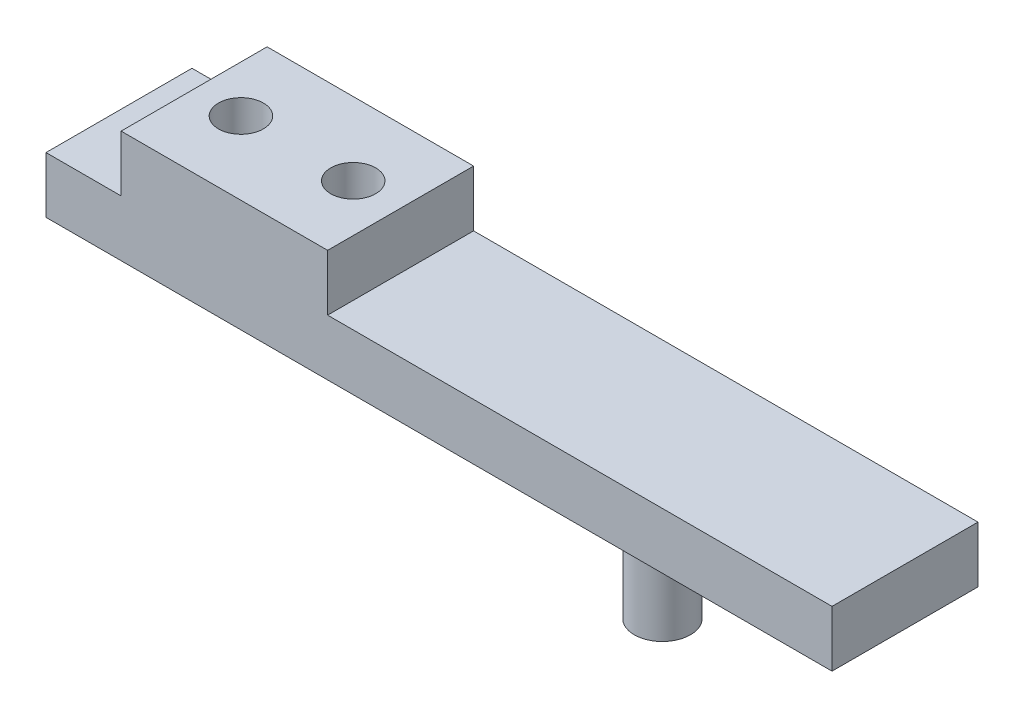
ISO-10303-21;
HEADER;
FILE_DESCRIPTION(('STEP AP214'),'2;1');
FILE_NAME('part.step','',(''),(''),'','','');
FILE_SCHEMA(('AUTOMOTIVE_DESIGN { 1 0 10303 214 1 1 1 1 }'));
ENDSEC;
DATA;
#1=APPLICATION_CONTEXT('core data for automotive mechanical design processes');
#2=APPLICATION_PROTOCOL_DEFINITION('international standard','automotive_design',2000,#1);
#3=PRODUCT_CONTEXT('',#1,'mechanical');
#4=PRODUCT('Part','Part','',(#3));
#5=PRODUCT_RELATED_PRODUCT_CATEGORY('part','',(#4));
#6=PRODUCT_DEFINITION_FORMATION('','',#4);
#7=PRODUCT_DEFINITION_CONTEXT('part definition',#1,'design');
#8=PRODUCT_DEFINITION('design','',#6,#7);
#9=PRODUCT_DEFINITION_SHAPE('','',#8);
#10=(LENGTH_UNIT() NAMED_UNIT(*) SI_UNIT(.MILLI.,.METRE.));
#11=(NAMED_UNIT(*) PLANE_ANGLE_UNIT() SI_UNIT($,.RADIAN.));
#12=(NAMED_UNIT(*) SI_UNIT($,.STERADIAN.) SOLID_ANGLE_UNIT());
#13=UNCERTAINTY_MEASURE_WITH_UNIT(LENGTH_MEASURE(1.E-05),#10,'distance_accuracy_value','');
#14=(GEOMETRIC_REPRESENTATION_CONTEXT(3) GLOBAL_UNCERTAINTY_ASSIGNED_CONTEXT((#13)) GLOBAL_UNIT_ASSIGNED_CONTEXT((#10,
#11,#12)) REPRESENTATION_CONTEXT('',''));
#15=CARTESIAN_POINT('',(0.,0.,0.));
#16=DIRECTION('',(0.,0.,1.));
#17=DIRECTION('',(1.,0.,0.));
#18=AXIS2_PLACEMENT_3D('',#15,#16,#17);
#19=CARTESIAN_POINT('',(0.,5.,0.));
#20=DIRECTION('',(0.,1.,0.));
#21=DIRECTION('',(0.,0.,1.));
#22=AXIS2_PLACEMENT_3D('',#19,#20,#21);
#23=PLANE('',#22);
#24=DIRECTION('',(0.,0.,1.));
#25=VECTOR('',#24,1.);
#26=CARTESIAN_POINT('',(-28.3095534894096,5.,-6.5));
#27=LINE('',#26,#25);
#28=CARTESIAN_POINT('',(-28.3095534894096,5.,-6.5));
#29=VERTEX_POINT('',#28);
#30=CARTESIAN_POINT('',(-28.3095534894096,5.,6.5));
#31=VERTEX_POINT('',#30);
#32=EDGE_CURVE('E125',#29,#31,#27,.T.);
#33=ORIENTED_EDGE('',*,*,#32,.F.);
#34=DIRECTION('',(-1.,0.,0.));
#35=VECTOR('',#34,1.);
#36=CARTESIAN_POINT('',(-35.,5.,-6.5));
#37=LINE('',#36,#35);
#38=CARTESIAN_POINT('',(-35.,5.,-6.5));
#39=VERTEX_POINT('',#38);
#40=EDGE_CURVE('E141',#29,#39,#37,.T.);
#41=ORIENTED_EDGE('',*,*,#40,.T.);
#42=DIRECTION('',(0.,0.,1.));
#43=VECTOR('',#42,1.);
#44=CARTESIAN_POINT('',(-35.,5.,-6.5));
#45=LINE('',#44,#43);
#46=CARTESIAN_POINT('',(-35.,5.,6.5));
#47=VERTEX_POINT('',#46);
#48=EDGE_CURVE('E145',#39,#47,#45,.T.);
#49=ORIENTED_EDGE('',*,*,#48,.T.);
#50=DIRECTION('',(1.,0.,0.));
#51=VECTOR('',#50,1.);
#52=CARTESIAN_POINT('',(-35.,5.,6.5));
#53=LINE('',#52,#51);
#54=EDGE_CURVE('E61',#47,#31,#53,.T.);
#55=ORIENTED_EDGE('',*,*,#54,.T.);
#56=EDGE_LOOP('',(#33,#41,#49,#55));
#57=FACE_BOUND('',#56,.T.);
#58=ADVANCED_FACE('F38',(#57),#23,.T.);
#59=CARTESIAN_POINT('',(35.,5.,-6.5));
#60=DIRECTION('',(-1.,0.,0.));
#61=DIRECTION('',(0.,0.,1.));
#62=AXIS2_PLACEMENT_3D('',#59,#60,#61);
#63=PLANE('',#62);
#64=DIRECTION('',(0.,0.,-1.));
#65=VECTOR('',#64,1.);
#66=CARTESIAN_POINT('',(35.,0.,-6.5));
#67=LINE('',#66,#65);
#68=CARTESIAN_POINT('',(35.,0.,6.5));
#69=VERTEX_POINT('',#68);
#70=CARTESIAN_POINT('',(35.,0.,-6.5));
#71=VERTEX_POINT('',#70);
#72=EDGE_CURVE('E136',#69,#71,#67,.T.);
#73=ORIENTED_EDGE('',*,*,#72,.T.);
#74=DIRECTION('',(0.,-1.,0.));
#75=VECTOR('',#74,1.);
#76=CARTESIAN_POINT('',(35.,5.,-6.5));
#77=LINE('',#76,#75);
#78=CARTESIAN_POINT('',(35.,5.,-6.5));
#79=VERTEX_POINT('',#78);
#80=EDGE_CURVE('E46',#79,#71,#77,.T.);
#81=ORIENTED_EDGE('',*,*,#80,.F.);
#82=DIRECTION('',(0.,0.,-1.));
#83=VECTOR('',#82,1.);
#84=CARTESIAN_POINT('',(35.,5.,-6.5));
#85=LINE('',#84,#83);
#86=CARTESIAN_POINT('',(35.,5.,6.5));
#87=VERTEX_POINT('',#86);
#88=EDGE_CURVE('E138',#87,#79,#85,.T.);
#89=ORIENTED_EDGE('',*,*,#88,.F.);
#90=DIRECTION('',(0.,-1.,0.));
#91=VECTOR('',#90,1.);
#92=CARTESIAN_POINT('',(35.,5.,6.5));
#93=LINE('',#92,#91);
#94=EDGE_CURVE('E149',#87,#69,#93,.T.);
#95=ORIENTED_EDGE('',*,*,#94,.T.);
#96=EDGE_LOOP('',(#73,#81,#89,#95));
#97=FACE_BOUND('',#96,.T.);
#98=ADVANCED_FACE('F40',(#97),#63,.F.);
#99=CARTESIAN_POINT('',(-35.,5.,-6.5));
#100=DIRECTION('',(0.,0.,1.));
#101=DIRECTION('',(1.,0.,0.));
#102=AXIS2_PLACEMENT_3D('',#99,#100,#101);
#103=PLANE('',#102);
#104=DIRECTION('',(-1.,0.,0.));
#105=VECTOR('',#104,1.);
#106=CARTESIAN_POINT('',(-35.,0.,-6.5));
#107=LINE('',#106,#105);
#108=CARTESIAN_POINT('',(-35.,0.,-6.5));
#109=VERTEX_POINT('',#108);
#110=EDGE_CURVE('E152',#71,#109,#107,.T.);
#111=ORIENTED_EDGE('',*,*,#110,.T.);
#112=DIRECTION('',(0.,-1.,0.));
#113=VECTOR('',#112,1.);
#114=CARTESIAN_POINT('',(-35.,5.,-6.5));
#115=LINE('',#114,#113);
#116=EDGE_CURVE('E162',#39,#109,#115,.T.);
#117=ORIENTED_EDGE('',*,*,#116,.F.);
#118=ORIENTED_EDGE('',*,*,#40,.F.);
#119=DIRECTION('',(0.,-1.,0.));
#120=VECTOR('',#119,1.);
#121=CARTESIAN_POINT('',(-28.3095534894096,10.,-6.5));
#122=LINE('',#121,#120);
#123=CARTESIAN_POINT('',(-28.3095534894096,10.,-6.5));
#124=VERTEX_POINT('',#123);
#125=EDGE_CURVE('E187',#124,#29,#122,.T.);
#126=ORIENTED_EDGE('',*,*,#125,.F.);
#127=DIRECTION('',(-1.,0.,0.));
#128=VECTOR('',#127,1.);
#129=CARTESIAN_POINT('',(-28.3095534894096,10.,-6.5));
#130=LINE('',#129,#128);
#131=CARTESIAN_POINT('',(-9.91920416380848,10.,-6.5));
#132=VERTEX_POINT('',#131);
#133=EDGE_CURVE('E119',#132,#124,#130,.T.);
#134=ORIENTED_EDGE('',*,*,#133,.F.);
#135=DIRECTION('',(0.,-1.,0.));
#136=VECTOR('',#135,1.);
#137=CARTESIAN_POINT('',(-9.91920416380848,10.,-6.5));
#138=LINE('',#137,#136);
#139=CARTESIAN_POINT('',(-9.91920416380848,5.,-6.5));
#140=VERTEX_POINT('',#139);
#141=EDGE_CURVE('E131',#132,#140,#138,.T.);
#142=ORIENTED_EDGE('',*,*,#141,.T.);
#143=EDGE_CURVE('E143',#79,#140,#37,.T.);
#144=ORIENTED_EDGE('',*,*,#143,.F.);
#145=ORIENTED_EDGE('',*,*,#80,.T.);
#146=EDGE_LOOP('',(#111,#117,#118,#126,#134,#142,#144,#145));
#147=FACE_BOUND('',#146,.T.);
#148=ADVANCED_FACE('F167',(#147),#103,.F.);
#149=CARTESIAN_POINT('',(-35.,5.,-6.5));
#150=DIRECTION('',(1.,0.,0.));
#151=DIRECTION('',(0.,0.,-1.));
#152=AXIS2_PLACEMENT_3D('',#149,#150,#151);
#153=PLANE('',#152);
#154=DIRECTION('',(0.,0.,1.));
#155=VECTOR('',#154,1.);
#156=CARTESIAN_POINT('',(-35.,0.,-6.5));
#157=LINE('',#156,#155);
#158=CARTESIAN_POINT('',(-35.,0.,6.5));
#159=VERTEX_POINT('',#158);
#160=EDGE_CURVE('E154',#109,#159,#157,.T.);
#161=ORIENTED_EDGE('',*,*,#160,.T.);
#162=DIRECTION('',(0.,-1.,0.));
#163=VECTOR('',#162,1.);
#164=CARTESIAN_POINT('',(-35.,5.,6.5));
#165=LINE('',#164,#163);
#166=EDGE_CURVE('E159',#47,#159,#165,.T.);
#167=ORIENTED_EDGE('',*,*,#166,.F.);
#168=ORIENTED_EDGE('',*,*,#48,.F.);
#169=ORIENTED_EDGE('',*,*,#116,.T.);
#170=EDGE_LOOP('',(#161,#167,#168,#169));
#171=FACE_BOUND('',#170,.T.);
#172=ADVANCED_FACE('F180',(#171),#153,.F.);
#173=CARTESIAN_POINT('',(-35.,5.,6.5));
#174=DIRECTION('',(0.,0.,-1.));
#175=DIRECTION('',(-1.,0.,0.));
#176=AXIS2_PLACEMENT_3D('',#173,#174,#175);
#177=PLANE('',#176);
#178=DIRECTION('',(1.,0.,0.));
#179=VECTOR('',#178,1.);
#180=CARTESIAN_POINT('',(-35.,0.,6.5));
#181=LINE('',#180,#179);
#182=EDGE_CURVE('E142',#159,#69,#181,.T.);
#183=ORIENTED_EDGE('',*,*,#182,.T.);
#184=ORIENTED_EDGE('',*,*,#94,.F.);
#185=CARTESIAN_POINT('',(-9.91920416380848,5.,6.5));
#186=VERTEX_POINT('',#185);
#187=EDGE_CURVE('E147',#186,#87,#53,.T.);
#188=ORIENTED_EDGE('',*,*,#187,.F.);
#189=DIRECTION('',(0.,-1.,0.));
#190=VECTOR('',#189,1.);
#191=CARTESIAN_POINT('',(-9.91920416380848,10.,6.5));
#192=LINE('',#191,#190);
#193=CARTESIAN_POINT('',(-9.91920416380848,10.,6.5));
#194=VERTEX_POINT('',#193);
#195=EDGE_CURVE('E109',#194,#186,#192,.T.);
#196=ORIENTED_EDGE('',*,*,#195,.F.);
#197=DIRECTION('',(1.,0.,0.));
#198=VECTOR('',#197,1.);
#199=CARTESIAN_POINT('',(-28.3095534894096,10.,6.5));
#200=LINE('',#199,#198);
#201=CARTESIAN_POINT('',(-28.3095534894096,10.,6.5));
#202=VERTEX_POINT('',#201);
#203=EDGE_CURVE('E102',#202,#194,#200,.T.);
#204=ORIENTED_EDGE('',*,*,#203,.F.);
#205=DIRECTION('',(0.,-1.,0.));
#206=VECTOR('',#205,1.);
#207=CARTESIAN_POINT('',(-28.3095534894096,10.,6.5));
#208=LINE('',#207,#206);
#209=EDGE_CURVE('E106',#202,#31,#208,.T.);
#210=ORIENTED_EDGE('',*,*,#209,.T.);
#211=ORIENTED_EDGE('',*,*,#54,.F.);
#212=ORIENTED_EDGE('',*,*,#166,.T.);
#213=EDGE_LOOP('',(#183,#184,#188,#196,#204,#210,#211,#212));
#214=FACE_BOUND('',#213,.T.);
#215=ADVANCED_FACE('F104',(#214),#177,.F.);
#216=DIRECTION('',(0.,0.,-1.));
#217=VECTOR('',#216,1.);
#218=CARTESIAN_POINT('',(-9.91920416380848,5.,-6.5));
#219=LINE('',#218,#217);
#220=EDGE_CURVE('E53',#186,#140,#219,.T.);
#221=ORIENTED_EDGE('',*,*,#220,.F.);
#222=ORIENTED_EDGE('',*,*,#187,.T.);
#223=ORIENTED_EDGE('',*,*,#88,.T.);
#224=ORIENTED_EDGE('',*,*,#143,.T.);
#225=EDGE_LOOP('',(#221,#222,#223,#224));
#226=FACE_BOUND('',#225,.T.);
#227=ADVANCED_FACE('F182',(#226),#23,.T.);
#228=CARTESIAN_POINT('',(0.,0.,0.));
#229=DIRECTION('',(0.,1.,0.));
#230=DIRECTION('',(0.,0.,1.));
#231=AXIS2_PLACEMENT_3D('',#228,#229,#230);
#232=PLANE('',#231);
#233=CARTESIAN_POINT('',(13.3945457686465,0.,0.));
#234=DIRECTION('',(0.,1.,0.));
#235=DIRECTION('',(0.,0.,1.));
#236=AXIS2_PLACEMENT_3D('',#233,#234,#235);
#237=CIRCLE('',#236,2.5);
#238=CARTESIAN_POINT('',(13.3945457686465,0.,2.5));
#239=VERTEX_POINT('',#238);
#240=EDGE_CURVE('E11',#239,#239,#237,.F.);
#241=ORIENTED_EDGE('',*,*,#240,.F.);
#242=EDGE_LOOP('',(#241));
#243=FACE_BOUND('',#242,.T.);
#244=CARTESIAN_POINT('',(-24.141309666895,0.,0.));
#245=DIRECTION('',(0.,1.,0.));
#246=DIRECTION('',(0.,0.,1.));
#247=AXIS2_PLACEMENT_3D('',#244,#245,#246);
#248=CIRCLE('',#247,2.);
#249=CARTESIAN_POINT('',(-24.141309666895,0.,2.));
#250=VERTEX_POINT('',#249);
#251=EDGE_CURVE('E129',#250,#250,#248,.T.);
#252=ORIENTED_EDGE('',*,*,#251,.T.);
#253=EDGE_LOOP('',(#252));
#254=FACE_BOUND('',#253,.T.);
#255=CARTESIAN_POINT('',(-14.141309666895,0.,0.));
#256=DIRECTION('',(0.,1.,0.));
#257=DIRECTION('',(0.,0.,1.));
#258=AXIS2_PLACEMENT_3D('',#255,#256,#257);
#259=CIRCLE('',#258,2.);
#260=CARTESIAN_POINT('',(-14.141309666895,0.,2.));
#261=VERTEX_POINT('',#260);
#262=EDGE_CURVE('E126',#261,#261,#259,.T.);
#263=ORIENTED_EDGE('',*,*,#262,.T.);
#264=EDGE_LOOP('',(#263));
#265=FACE_BOUND('',#264,.T.);
#266=ORIENTED_EDGE('',*,*,#72,.F.);
#267=ORIENTED_EDGE('',*,*,#182,.F.);
#268=ORIENTED_EDGE('',*,*,#160,.F.);
#269=ORIENTED_EDGE('',*,*,#110,.F.);
#270=EDGE_LOOP('',(#266,#267,#268,#269));
#271=FACE_BOUND('',#270,.T.);
#272=ADVANCED_FACE('F176',(#243,#254,#265,#271),#232,.F.);
#273=CARTESIAN_POINT('',(-14.141309666895,0.,0.));
#274=DIRECTION('',(0.,1.,0.));
#275=DIRECTION('',(0.,0.,1.));
#276=AXIS2_PLACEMENT_3D('',#273,#274,#275);
#277=CYLINDRICAL_SURFACE('',#276,2.);
#278=ORIENTED_EDGE('',*,*,#262,.F.);
#279=EDGE_LOOP('',(#278));
#280=FACE_BOUND('',#279,.T.);
#281=CARTESIAN_POINT('',(-14.141309666895,10.,0.));
#282=DIRECTION('',(0.,1.,0.));
#283=DIRECTION('',(0.,0.,1.));
#284=AXIS2_PLACEMENT_3D('',#281,#282,#283);
#285=CIRCLE('',#284,2.);
#286=CARTESIAN_POINT('',(-14.141309666895,10.,2.));
#287=VERTEX_POINT('',#286);
#288=EDGE_CURVE('E196',#287,#287,#285,.T.);
#289=ORIENTED_EDGE('',*,*,#288,.T.);
#290=EDGE_LOOP('',(#289));
#291=FACE_BOUND('',#290,.T.);
#292=ADVANCED_FACE('F213',(#280,#291),#277,.F.);
#293=CARTESIAN_POINT('',(-24.141309666895,0.,0.));
#294=DIRECTION('',(0.,1.,0.));
#295=DIRECTION('',(0.,0.,1.));
#296=AXIS2_PLACEMENT_3D('',#293,#294,#295);
#297=CYLINDRICAL_SURFACE('',#296,2.);
#298=ORIENTED_EDGE('',*,*,#251,.F.);
#299=EDGE_LOOP('',(#298));
#300=FACE_BOUND('',#299,.T.);
#301=CARTESIAN_POINT('',(-24.141309666895,10.,0.));
#302=DIRECTION('',(0.,1.,0.));
#303=DIRECTION('',(0.,0.,1.));
#304=AXIS2_PLACEMENT_3D('',#301,#302,#303);
#305=CIRCLE('',#304,2.);
#306=CARTESIAN_POINT('',(-24.141309666895,10.,2.));
#307=VERTEX_POINT('',#306);
#308=EDGE_CURVE('E191',#307,#307,#305,.T.);
#309=ORIENTED_EDGE('',*,*,#308,.T.);
#310=EDGE_LOOP('',(#309));
#311=FACE_BOUND('',#310,.T.);
#312=ADVANCED_FACE('F221',(#300,#311),#297,.F.);
#313=CARTESIAN_POINT('',(0.,10.,0.));
#314=DIRECTION('',(0.,1.,0.));
#315=DIRECTION('',(0.,0.,1.));
#316=AXIS2_PLACEMENT_3D('',#313,#314,#315);
#317=PLANE('',#316);
#318=ORIENTED_EDGE('',*,*,#308,.F.);
#319=EDGE_LOOP('',(#318));
#320=FACE_BOUND('',#319,.T.);
#321=DIRECTION('',(0.,0.,1.));
#322=VECTOR('',#321,1.);
#323=CARTESIAN_POINT('',(-28.3095534894096,10.,-6.5));
#324=LINE('',#323,#322);
#325=EDGE_CURVE('E113',#124,#202,#324,.T.);
#326=ORIENTED_EDGE('',*,*,#325,.T.);
#327=ORIENTED_EDGE('',*,*,#203,.T.);
#328=DIRECTION('',(0.,0.,-1.));
#329=VECTOR('',#328,1.);
#330=CARTESIAN_POINT('',(-9.91920416380848,10.,-6.5));
#331=LINE('',#330,#329);
#332=EDGE_CURVE('E112',#194,#132,#331,.T.);
#333=ORIENTED_EDGE('',*,*,#332,.T.);
#334=ORIENTED_EDGE('',*,*,#133,.T.);
#335=EDGE_LOOP('',(#326,#327,#333,#334));
#336=FACE_BOUND('',#335,.T.);
#337=ORIENTED_EDGE('',*,*,#288,.F.);
#338=EDGE_LOOP('',(#337));
#339=FACE_BOUND('',#338,.T.);
#340=ADVANCED_FACE('F116',(#320,#336,#339),#317,.T.);
#341=CARTESIAN_POINT('',(-28.3095534894096,10.,-6.5));
#342=DIRECTION('',(1.,0.,0.));
#343=DIRECTION('',(0.,0.,-1.));
#344=AXIS2_PLACEMENT_3D('',#341,#342,#343);
#345=PLANE('',#344);
#346=ORIENTED_EDGE('',*,*,#32,.T.);
#347=ORIENTED_EDGE('',*,*,#209,.F.);
#348=ORIENTED_EDGE('',*,*,#325,.F.);
#349=ORIENTED_EDGE('',*,*,#125,.T.);
#350=EDGE_LOOP('',(#346,#347,#348,#349));
#351=FACE_BOUND('',#350,.T.);
#352=ADVANCED_FACE('F124',(#351),#345,.F.);
#353=CARTESIAN_POINT('',(-9.91920416380848,10.,-6.5));
#354=DIRECTION('',(-1.,0.,0.));
#355=DIRECTION('',(0.,0.,1.));
#356=AXIS2_PLACEMENT_3D('',#353,#354,#355);
#357=PLANE('',#356);
#358=ORIENTED_EDGE('',*,*,#220,.T.);
#359=ORIENTED_EDGE('',*,*,#141,.F.);
#360=ORIENTED_EDGE('',*,*,#332,.F.);
#361=ORIENTED_EDGE('',*,*,#195,.T.);
#362=EDGE_LOOP('',(#358,#359,#360,#361));
#363=FACE_BOUND('',#362,.T.);
#364=ADVANCED_FACE('F185',(#363),#357,.F.);
#365=CARTESIAN_POINT('',(13.3945457686465,-10.,0.));
#366=DIRECTION('',(0.,1.,0.));
#367=DIRECTION('',(0.,0.,1.));
#368=AXIS2_PLACEMENT_3D('',#365,#366,#367);
#369=CYLINDRICAL_SURFACE('',#368,2.5);
#370=CARTESIAN_POINT('',(13.3945457686465,-10.,0.));
#371=DIRECTION('',(0.,-1.,0.));
#372=DIRECTION('',(0.,0.,-1.));
#373=AXIS2_PLACEMENT_3D('',#370,#371,#372);
#374=CIRCLE('',#373,2.5);
#375=CARTESIAN_POINT('',(13.3945457686465,-10.,-2.5));
#376=VERTEX_POINT('',#375);
#377=EDGE_CURVE('E199',#376,#376,#374,.T.);
#378=ORIENTED_EDGE('',*,*,#377,.F.);
#379=EDGE_LOOP('',(#378));
#380=FACE_BOUND('',#379,.T.);
#381=ORIENTED_EDGE('',*,*,#240,.T.);
#382=EDGE_LOOP('',(#381));
#383=FACE_BOUND('',#382,.T.);
#384=ADVANCED_FACE('F205',(#380,#383),#369,.T.);
#385=CARTESIAN_POINT('',(13.3945457686465,-10.,0.));
#386=DIRECTION('',(0.,-1.,0.));
#387=DIRECTION('',(0.,0.,-1.));
#388=AXIS2_PLACEMENT_3D('',#385,#386,#387);
#389=PLANE('',#388);
#390=ORIENTED_EDGE('',*,*,#377,.T.);
#391=EDGE_LOOP('',(#390));
#392=FACE_BOUND('',#391,.T.);
#393=ADVANCED_FACE('F203',(#392),#389,.T.);
#394=CLOSED_SHELL('',(#58,#98,#148,#172,#215,#227,#272,#292,#312,#340,#352,#364,#384,#393));
#395=MANIFOLD_SOLID_BREP('B2',#394);
#396=ADVANCED_BREP_SHAPE_REPRESENTATION('',(#18,#395),#14);
#397=SHAPE_DEFINITION_REPRESENTATION(#9,#396);
ENDSEC;
END-ISO-10303-21;
